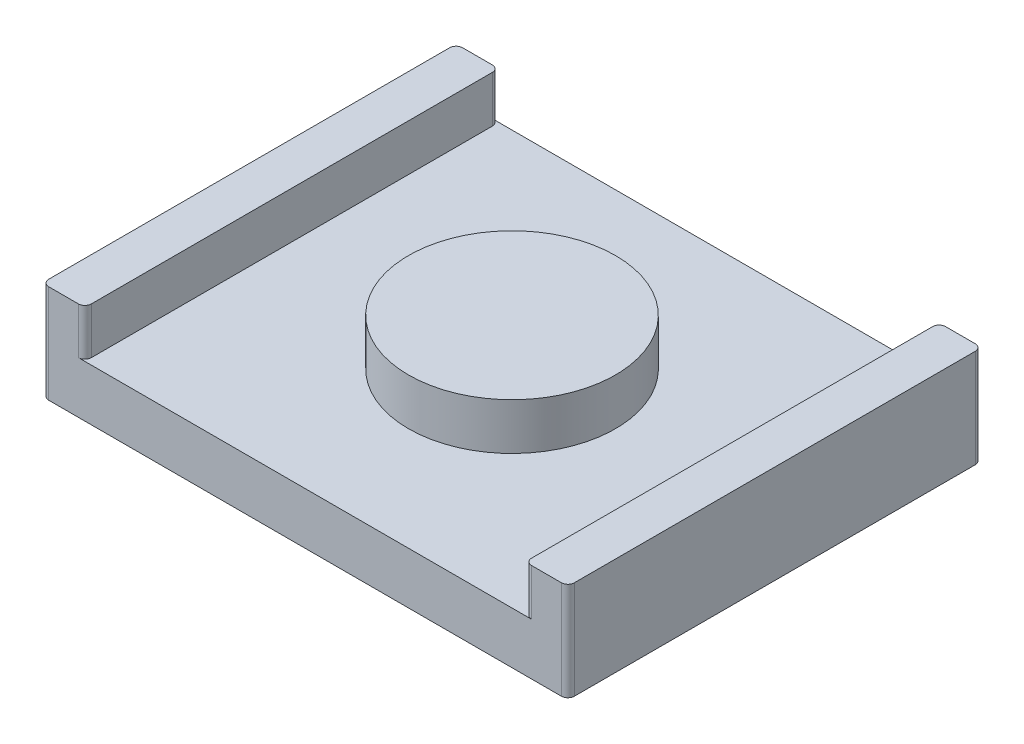
ISO-10303-21;
HEADER;
FILE_DESCRIPTION(('STEP AP214'),'2;1');
FILE_NAME('part.step','',(''),(''),'','','');
FILE_SCHEMA(('AUTOMOTIVE_DESIGN { 1 0 10303 214 1 1 1 1 }'));
ENDSEC;
DATA;
#1=APPLICATION_CONTEXT('core data for automotive mechanical design processes');
#2=APPLICATION_PROTOCOL_DEFINITION('international standard','automotive_design',2000,#1);
#3=PRODUCT_CONTEXT('',#1,'mechanical');
#4=PRODUCT('Part','Part','',(#3));
#5=PRODUCT_RELATED_PRODUCT_CATEGORY('part','',(#4));
#6=PRODUCT_DEFINITION_FORMATION('','',#4);
#7=PRODUCT_DEFINITION_CONTEXT('part definition',#1,'design');
#8=PRODUCT_DEFINITION('design','',#6,#7);
#9=PRODUCT_DEFINITION_SHAPE('','',#8);
#10=(LENGTH_UNIT() NAMED_UNIT(*) SI_UNIT(.MILLI.,.METRE.));
#11=(NAMED_UNIT(*) PLANE_ANGLE_UNIT() SI_UNIT($,.RADIAN.));
#12=(NAMED_UNIT(*) SI_UNIT($,.STERADIAN.) SOLID_ANGLE_UNIT());
#13=UNCERTAINTY_MEASURE_WITH_UNIT(LENGTH_MEASURE(1.E-05),#10,'distance_accuracy_value','');
#14=(GEOMETRIC_REPRESENTATION_CONTEXT(3) GLOBAL_UNCERTAINTY_ASSIGNED_CONTEXT((#13)) GLOBAL_UNIT_ASSIGNED_CONTEXT((#10,
#11,#12)) REPRESENTATION_CONTEXT('',''));
#15=CARTESIAN_POINT('',(0.,0.,0.));
#16=DIRECTION('',(0.,0.,1.));
#17=DIRECTION('',(1.,0.,0.));
#18=AXIS2_PLACEMENT_3D('',#15,#16,#17);
#19=CARTESIAN_POINT('',(0.,4.,0.));
#20=DIRECTION('',(0.,-1.,0.));
#21=DIRECTION('',(0.,0.,-1.));
#22=AXIS2_PLACEMENT_3D('',#19,#20,#21);
#23=PLANE('',#22);
#24=CARTESIAN_POINT('',(0.,4.,0.));
#25=DIRECTION('',(0.,1.,0.));
#26=DIRECTION('',(0.,0.,1.));
#27=AXIS2_PLACEMENT_3D('',#24,#25,#26);
#28=CIRCLE('',#27,8.);
#29=CARTESIAN_POINT('',(0.,4.,7.99999999999999));
#30=VERTEX_POINT('',#29);
#31=EDGE_CURVE('E180',#30,#30,#28,.T.);
#32=ORIENTED_EDGE('',*,*,#31,.F.);
#33=EDGE_LOOP('',(#32));
#34=FACE_BOUND('',#33,.T.);
#35=DIRECTION('',(1.,0.,0.));
#36=VECTOR('',#35,1.);
#37=CARTESIAN_POINT('',(-20.32,4.,16.));
#38=LINE('',#37,#36);
#39=CARTESIAN_POINT('',(-17.52,4.,16.));
#40=VERTEX_POINT('',#39);
#41=CARTESIAN_POINT('',(17.52,4.,16.));
#42=VERTEX_POINT('',#41);
#43=EDGE_CURVE('E191',#40,#42,#38,.T.);
#44=ORIENTED_EDGE('',*,*,#43,.T.);
#45=CARTESIAN_POINT('',(17.52,4.,15.5));
#46=DIRECTION('',(0.,-1.,0.));
#47=DIRECTION('',(0.,0.,-1.));
#48=AXIS2_PLACEMENT_3D('',#45,#46,#47);
#49=CIRCLE('',#48,0.5);
#50=CARTESIAN_POINT('',(17.02,4.,15.5));
#51=VERTEX_POINT('',#50);
#52=EDGE_CURVE('E276',#42,#51,#49,.T.);
#53=ORIENTED_EDGE('',*,*,#52,.T.);
#54=DIRECTION('',(0.,0.,-1.));
#55=VECTOR('',#54,1.);
#56=CARTESIAN_POINT('',(17.02,4.,-16.));
#57=LINE('',#56,#55);
#58=CARTESIAN_POINT('',(17.02,4.,-15.5));
#59=VERTEX_POINT('',#58);
#60=EDGE_CURVE('E400',#51,#59,#57,.T.);
#61=ORIENTED_EDGE('',*,*,#60,.T.);
#62=CARTESIAN_POINT('',(17.52,4.,-15.5));
#63=DIRECTION('',(0.,-1.,0.));
#64=DIRECTION('',(0.,0.,-1.));
#65=AXIS2_PLACEMENT_3D('',#62,#63,#64);
#66=CIRCLE('',#65,0.5);
#67=CARTESIAN_POINT('',(17.52,4.,-16.));
#68=VERTEX_POINT('',#67);
#69=EDGE_CURVE('E11',#59,#68,#66,.T.);
#70=ORIENTED_EDGE('',*,*,#69,.T.);
#71=DIRECTION('',(-1.,0.,0.));
#72=VECTOR('',#71,1.);
#73=CARTESIAN_POINT('',(-20.32,4.,-16.));
#74=LINE('',#73,#72);
#75=CARTESIAN_POINT('',(-17.52,4.,-16.));
#76=VERTEX_POINT('',#75);
#77=EDGE_CURVE('E184',#68,#76,#74,.T.);
#78=ORIENTED_EDGE('',*,*,#77,.T.);
#79=CARTESIAN_POINT('',(-17.52,4.,-15.5));
#80=DIRECTION('',(0.,-1.,0.));
#81=DIRECTION('',(0.,0.,-1.));
#82=AXIS2_PLACEMENT_3D('',#79,#80,#81);
#83=CIRCLE('',#82,0.5);
#84=CARTESIAN_POINT('',(-17.02,4.,-15.5));
#85=VERTEX_POINT('',#84);
#86=EDGE_CURVE('E52',#76,#85,#83,.T.);
#87=ORIENTED_EDGE('',*,*,#86,.T.);
#88=DIRECTION('',(0.,0.,-1.));
#89=VECTOR('',#88,1.);
#90=CARTESIAN_POINT('',(-17.02,4.,-16.));
#91=LINE('',#90,#89);
#92=CARTESIAN_POINT('',(-17.02,4.,15.5));
#93=VERTEX_POINT('',#92);
#94=EDGE_CURVE('E289',#93,#85,#91,.T.);
#95=ORIENTED_EDGE('',*,*,#94,.F.);
#96=CARTESIAN_POINT('',(-17.52,4.,15.5));
#97=DIRECTION('',(0.,-1.,0.));
#98=DIRECTION('',(0.,0.,-1.));
#99=AXIS2_PLACEMENT_3D('',#96,#97,#98);
#100=CIRCLE('',#99,0.5);
#101=EDGE_CURVE('E279',#93,#40,#100,.T.);
#102=ORIENTED_EDGE('',*,*,#101,.T.);
#103=EDGE_LOOP('',(#44,#53,#61,#70,#78,#87,#95,#102));
#104=FACE_BOUND('',#103,.T.);
#105=ADVANCED_FACE('F43',(#34,#104),#23,.F.);
#106=CARTESIAN_POINT('',(20.32,4.,16.));
#107=DIRECTION('',(-1.,0.,0.));
#108=DIRECTION('',(0.,0.,1.));
#109=AXIS2_PLACEMENT_3D('',#106,#107,#108);
#110=PLANE('',#109);
#111=DIRECTION('',(0.,0.,-1.));
#112=VECTOR('',#111,1.);
#113=CARTESIAN_POINT('',(20.32,0.,16.));
#114=LINE('',#113,#112);
#115=CARTESIAN_POINT('',(20.32,0.,15.5));
#116=VERTEX_POINT('',#115);
#117=CARTESIAN_POINT('',(20.32,0.,-15.5));
#118=VERTEX_POINT('',#117);
#119=EDGE_CURVE('E326',#116,#118,#114,.T.);
#120=ORIENTED_EDGE('',*,*,#119,.T.);
#121=DIRECTION('',(0.,-1.,0.));
#122=VECTOR('',#121,1.);
#123=CARTESIAN_POINT('',(20.32,4.,-15.5));
#124=LINE('',#123,#122);
#125=CARTESIAN_POINT('',(20.32,7.6,-15.5));
#126=VERTEX_POINT('',#125);
#127=EDGE_CURVE('E273',#118,#126,#124,.F.);
#128=ORIENTED_EDGE('',*,*,#127,.T.);
#129=DIRECTION('',(0.,0.,1.));
#130=VECTOR('',#129,1.);
#131=CARTESIAN_POINT('',(20.32,7.6,-16.));
#132=LINE('',#131,#130);
#133=CARTESIAN_POINT('',(20.32,7.6,15.5));
#134=VERTEX_POINT('',#133);
#135=EDGE_CURVE('E300',#126,#134,#132,.T.);
#136=ORIENTED_EDGE('',*,*,#135,.T.);
#137=DIRECTION('',(0.,-1.,0.));
#138=VECTOR('',#137,1.);
#139=CARTESIAN_POINT('',(20.32,4.,15.5));
#140=LINE('',#139,#138);
#141=EDGE_CURVE('E270',#134,#116,#140,.T.);
#142=ORIENTED_EDGE('',*,*,#141,.T.);
#143=EDGE_LOOP('',(#120,#128,#136,#142));
#144=FACE_BOUND('',#143,.T.);
#145=ADVANCED_FACE('F350',(#144),#110,.F.);
#146=CARTESIAN_POINT('',(-20.32,4.,-16.));
#147=DIRECTION('',(0.,0.,1.));
#148=DIRECTION('',(1.,0.,0.));
#149=AXIS2_PLACEMENT_3D('',#146,#147,#148);
#150=PLANE('',#149);
#151=DIRECTION('',(-1.,0.,0.));
#152=VECTOR('',#151,1.);
#153=CARTESIAN_POINT('',(-20.32,7.6,-16.));
#154=LINE('',#153,#152);
#155=CARTESIAN_POINT('',(-17.52,7.6,-16.));
#156=VERTEX_POINT('',#155);
#157=CARTESIAN_POINT('',(-19.82,7.6,-16.));
#158=VERTEX_POINT('',#157);
#159=EDGE_CURVE('E299',#156,#158,#154,.T.);
#160=ORIENTED_EDGE('',*,*,#159,.F.);
#161=DIRECTION('',(0.,-1.,0.));
#162=VECTOR('',#161,1.);
#163=CARTESIAN_POINT('',(-17.52,4.,-16.));
#164=LINE('',#163,#162);
#165=EDGE_CURVE('E254',#156,#76,#164,.T.);
#166=ORIENTED_EDGE('',*,*,#165,.T.);
#167=ORIENTED_EDGE('',*,*,#77,.F.);
#168=DIRECTION('',(0.,-1.,0.));
#169=VECTOR('',#168,1.);
#170=CARTESIAN_POINT('',(17.52,7.6,-16.));
#171=LINE('',#170,#169);
#172=CARTESIAN_POINT('',(17.52,7.6,-16.));
#173=VERTEX_POINT('',#172);
#174=EDGE_CURVE('E251',#68,#173,#171,.F.);
#175=ORIENTED_EDGE('',*,*,#174,.T.);
#176=DIRECTION('',(1.,0.,0.));
#177=VECTOR('',#176,1.);
#178=CARTESIAN_POINT('',(20.32,7.6,-16.));
#179=LINE('',#178,#177);
#180=CARTESIAN_POINT('',(19.82,7.6,-16.));
#181=VERTEX_POINT('',#180);
#182=EDGE_CURVE('E418',#173,#181,#179,.T.);
#183=ORIENTED_EDGE('',*,*,#182,.T.);
#184=DIRECTION('',(0.,-1.,0.));
#185=VECTOR('',#184,1.);
#186=CARTESIAN_POINT('',(19.82,4.,-16.));
#187=LINE('',#186,#185);
#188=CARTESIAN_POINT('',(19.82,0.,-16.));
#189=VERTEX_POINT('',#188);
#190=EDGE_CURVE('E244',#181,#189,#187,.T.);
#191=ORIENTED_EDGE('',*,*,#190,.T.);
#192=DIRECTION('',(-1.,0.,0.));
#193=VECTOR('',#192,1.);
#194=CARTESIAN_POINT('',(-20.32,0.,-16.));
#195=LINE('',#194,#193);
#196=CARTESIAN_POINT('',(-19.82,0.,-16.));
#197=VERTEX_POINT('',#196);
#198=EDGE_CURVE('E194',#189,#197,#195,.T.);
#199=ORIENTED_EDGE('',*,*,#198,.T.);
#200=DIRECTION('',(0.,-1.,0.));
#201=VECTOR('',#200,1.);
#202=CARTESIAN_POINT('',(-19.82,4.,-16.));
#203=LINE('',#202,#201);
#204=EDGE_CURVE('E248',#197,#158,#203,.F.);
#205=ORIENTED_EDGE('',*,*,#204,.T.);
#206=EDGE_LOOP('',(#160,#166,#167,#175,#183,#191,#199,#205));
#207=FACE_BOUND('',#206,.T.);
#208=ADVANCED_FACE('F311',(#207),#150,.F.);
#209=CARTESIAN_POINT('',(-20.32,4.,16.));
#210=DIRECTION('',(1.,0.,0.));
#211=DIRECTION('',(0.,0.,-1.));
#212=AXIS2_PLACEMENT_3D('',#209,#210,#211);
#213=PLANE('',#212);
#214=DIRECTION('',(0.,0.,1.));
#215=VECTOR('',#214,1.);
#216=CARTESIAN_POINT('',(-20.32,7.6,-16.));
#217=LINE('',#216,#215);
#218=CARTESIAN_POINT('',(-20.32,7.6,-15.5));
#219=VERTEX_POINT('',#218);
#220=CARTESIAN_POINT('',(-20.32,7.6,15.5));
#221=VERTEX_POINT('',#220);
#222=EDGE_CURVE('E314',#219,#221,#217,.T.);
#223=ORIENTED_EDGE('',*,*,#222,.F.);
#224=DIRECTION('',(0.,-1.,0.));
#225=VECTOR('',#224,1.);
#226=CARTESIAN_POINT('',(-20.32,4.,-15.5));
#227=LINE('',#226,#225);
#228=CARTESIAN_POINT('',(-20.32,0.,-15.5));
#229=VERTEX_POINT('',#228);
#230=EDGE_CURVE('E168',#219,#229,#227,.T.);
#231=ORIENTED_EDGE('',*,*,#230,.T.);
#232=DIRECTION('',(0.,0.,1.));
#233=VECTOR('',#232,1.);
#234=CARTESIAN_POINT('',(-20.32,0.,16.));
#235=LINE('',#234,#233);
#236=CARTESIAN_POINT('',(-20.32,0.,15.5));
#237=VERTEX_POINT('',#236);
#238=EDGE_CURVE('E185',#229,#237,#235,.T.);
#239=ORIENTED_EDGE('',*,*,#238,.T.);
#240=DIRECTION('',(0.,-1.,0.));
#241=VECTOR('',#240,1.);
#242=CARTESIAN_POINT('',(-20.32,4.,15.5));
#243=LINE('',#242,#241);
#244=EDGE_CURVE('E163',#237,#221,#243,.F.);
#245=ORIENTED_EDGE('',*,*,#244,.T.);
#246=EDGE_LOOP('',(#223,#231,#239,#245));
#247=FACE_BOUND('',#246,.T.);
#248=ADVANCED_FACE('F342',(#247),#213,.F.);
#249=CARTESIAN_POINT('',(-20.32,4.,16.));
#250=DIRECTION('',(0.,0.,-1.));
#251=DIRECTION('',(-1.,0.,0.));
#252=AXIS2_PLACEMENT_3D('',#249,#250,#251);
#253=PLANE('',#252);
#254=DIRECTION('',(-1.,0.,0.));
#255=VECTOR('',#254,1.);
#256=CARTESIAN_POINT('',(20.32,7.6,16.));
#257=LINE('',#256,#255);
#258=CARTESIAN_POINT('',(19.82,7.6,16.));
#259=VERTEX_POINT('',#258);
#260=CARTESIAN_POINT('',(17.52,7.6,16.));
#261=VERTEX_POINT('',#260);
#262=EDGE_CURVE('E406',#259,#261,#257,.T.);
#263=ORIENTED_EDGE('',*,*,#262,.T.);
#264=DIRECTION('',(0.,-1.,0.));
#265=VECTOR('',#264,1.);
#266=CARTESIAN_POINT('',(17.52,4.,16.));
#267=LINE('',#266,#265);
#268=EDGE_CURVE('E203',#261,#42,#267,.T.);
#269=ORIENTED_EDGE('',*,*,#268,.T.);
#270=ORIENTED_EDGE('',*,*,#43,.F.);
#271=DIRECTION('',(0.,-1.,0.));
#272=VECTOR('',#271,1.);
#273=CARTESIAN_POINT('',(-17.52,4.,16.));
#274=LINE('',#273,#272);
#275=CARTESIAN_POINT('',(-17.52,7.6,16.));
#276=VERTEX_POINT('',#275);
#277=EDGE_CURVE('E200',#40,#276,#274,.F.);
#278=ORIENTED_EDGE('',*,*,#277,.T.);
#279=DIRECTION('',(1.,0.,0.));
#280=VECTOR('',#279,1.);
#281=CARTESIAN_POINT('',(-20.32,7.6,16.));
#282=LINE('',#281,#280);
#283=CARTESIAN_POINT('',(-19.82,7.6,16.));
#284=VERTEX_POINT('',#283);
#285=EDGE_CURVE('E177',#284,#276,#282,.T.);
#286=ORIENTED_EDGE('',*,*,#285,.F.);
#287=DIRECTION('',(0.,-1.,0.));
#288=VECTOR('',#287,1.);
#289=CARTESIAN_POINT('',(-19.82,4.,16.));
#290=LINE('',#289,#288);
#291=CARTESIAN_POINT('',(-19.82,0.,16.));
#292=VERTEX_POINT('',#291);
#293=EDGE_CURVE('E162',#284,#292,#290,.T.);
#294=ORIENTED_EDGE('',*,*,#293,.T.);
#295=DIRECTION('',(1.,0.,0.));
#296=VECTOR('',#295,1.);
#297=CARTESIAN_POINT('',(-20.32,0.,16.));
#298=LINE('',#297,#296);
#299=CARTESIAN_POINT('',(19.82,0.,16.));
#300=VERTEX_POINT('',#299);
#301=EDGE_CURVE('E175',#292,#300,#298,.T.);
#302=ORIENTED_EDGE('',*,*,#301,.T.);
#303=DIRECTION('',(0.,-1.,0.));
#304=VECTOR('',#303,1.);
#305=CARTESIAN_POINT('',(19.82,4.,16.));
#306=LINE('',#305,#304);
#307=EDGE_CURVE('E179',#300,#259,#306,.F.);
#308=ORIENTED_EDGE('',*,*,#307,.T.);
#309=EDGE_LOOP('',(#263,#269,#270,#278,#286,#294,#302,#308));
#310=FACE_BOUND('',#309,.T.);
#311=ADVANCED_FACE('F174',(#310),#253,.F.);
#312=CARTESIAN_POINT('',(0.,0.,0.));
#313=DIRECTION('',(0.,-1.,0.));
#314=DIRECTION('',(0.,0.,-1.));
#315=AXIS2_PLACEMENT_3D('',#312,#313,#314);
#316=PLANE('',#315);
#317=ORIENTED_EDGE('',*,*,#238,.F.);
#318=CARTESIAN_POINT('',(-19.82,0.,-15.5));
#319=DIRECTION('',(0.,-1.,0.));
#320=DIRECTION('',(0.,0.,-1.));
#321=AXIS2_PLACEMENT_3D('',#318,#319,#320);
#322=CIRCLE('',#321,0.5);
#323=EDGE_CURVE('E267',#229,#197,#322,.T.);
#324=ORIENTED_EDGE('',*,*,#323,.T.);
#325=ORIENTED_EDGE('',*,*,#198,.F.);
#326=CARTESIAN_POINT('',(19.82,0.,-15.5));
#327=DIRECTION('',(0.,-1.,0.));
#328=DIRECTION('',(0.,0.,-1.));
#329=AXIS2_PLACEMENT_3D('',#326,#327,#328);
#330=CIRCLE('',#329,0.5);
#331=EDGE_CURVE('E59',#189,#118,#330,.T.);
#332=ORIENTED_EDGE('',*,*,#331,.T.);
#333=ORIENTED_EDGE('',*,*,#119,.F.);
#334=CARTESIAN_POINT('',(19.82,0.,15.5));
#335=DIRECTION('',(0.,-1.,0.));
#336=DIRECTION('',(0.,0.,-1.));
#337=AXIS2_PLACEMENT_3D('',#334,#335,#336);
#338=CIRCLE('',#337,0.5);
#339=EDGE_CURVE('E67',#116,#300,#338,.T.);
#340=ORIENTED_EDGE('',*,*,#339,.T.);
#341=ORIENTED_EDGE('',*,*,#301,.F.);
#342=CARTESIAN_POINT('',(-19.82,0.,15.5));
#343=DIRECTION('',(0.,-1.,0.));
#344=DIRECTION('',(0.,0.,-1.));
#345=AXIS2_PLACEMENT_3D('',#342,#343,#344);
#346=CIRCLE('',#345,0.5);
#347=EDGE_CURVE('E159',#292,#237,#346,.T.);
#348=ORIENTED_EDGE('',*,*,#347,.T.);
#349=EDGE_LOOP('',(#317,#324,#325,#332,#333,#340,#341,#348));
#350=FACE_BOUND('',#349,.T.);
#351=ADVANCED_FACE('F182',(#350),#316,.T.);
#352=CARTESIAN_POINT('',(0.,7.6,0.));
#353=DIRECTION('',(0.,-1.,0.));
#354=DIRECTION('',(0.,0.,-1.));
#355=AXIS2_PLACEMENT_3D('',#352,#353,#354);
#356=CYLINDRICAL_SURFACE('',#355,8.);
#357=CARTESIAN_POINT('',(0.,7.6,0.));
#358=DIRECTION('',(0.,1.,0.));
#359=DIRECTION('',(0.,0.,1.));
#360=AXIS2_PLACEMENT_3D('',#357,#358,#359);
#361=CIRCLE('',#360,8.);
#362=CARTESIAN_POINT('',(0.,7.6,7.99999999999999));
#363=VERTEX_POINT('',#362);
#364=EDGE_CURVE('E322',#363,#363,#361,.T.);
#365=ORIENTED_EDGE('',*,*,#364,.F.);
#366=EDGE_LOOP('',(#365));
#367=FACE_BOUND('',#366,.T.);
#368=ORIENTED_EDGE('',*,*,#31,.T.);
#369=EDGE_LOOP('',(#368));
#370=FACE_BOUND('',#369,.T.);
#371=ADVANCED_FACE('F363',(#367,#370),#356,.T.);
#372=CARTESIAN_POINT('',(0.,7.6,0.));
#373=DIRECTION('',(0.,1.,0.));
#374=DIRECTION('',(0.,0.,1.));
#375=AXIS2_PLACEMENT_3D('',#372,#373,#374);
#376=PLANE('',#375);
#377=ORIENTED_EDGE('',*,*,#364,.T.);
#378=EDGE_LOOP('',(#377));
#379=FACE_BOUND('',#378,.T.);
#380=ADVANCED_FACE('F369',(#379),#376,.T.);
#381=CARTESIAN_POINT('',(-17.02,39.769706246716,-16.));
#382=DIRECTION('',(-1.,0.,0.));
#383=DIRECTION('',(0.,0.,1.));
#384=AXIS2_PLACEMENT_3D('',#381,#382,#383);
#385=PLANE('',#384);
#386=DIRECTION('',(0.,0.,-1.));
#387=VECTOR('',#386,1.);
#388=CARTESIAN_POINT('',(-17.02,7.6,-16.));
#389=LINE('',#388,#387);
#390=CARTESIAN_POINT('',(-17.02,7.6,15.5));
#391=VERTEX_POINT('',#390);
#392=CARTESIAN_POINT('',(-17.02,7.6,-15.5));
#393=VERTEX_POINT('',#392);
#394=EDGE_CURVE('E309',#391,#393,#389,.T.);
#395=ORIENTED_EDGE('',*,*,#394,.F.);
#396=DIRECTION('',(0.,-1.,0.));
#397=VECTOR('',#396,1.);
#398=CARTESIAN_POINT('',(-17.02,39.769706246716,15.5));
#399=LINE('',#398,#397);
#400=EDGE_CURVE('E228',#391,#93,#399,.T.);
#401=ORIENTED_EDGE('',*,*,#400,.T.);
#402=ORIENTED_EDGE('',*,*,#94,.T.);
#403=DIRECTION('',(0.,-1.,0.));
#404=VECTOR('',#403,1.);
#405=CARTESIAN_POINT('',(-17.02,39.769706246716,-15.5));
#406=LINE('',#405,#404);
#407=EDGE_CURVE('E225',#85,#393,#406,.F.);
#408=ORIENTED_EDGE('',*,*,#407,.T.);
#409=EDGE_LOOP('',(#395,#401,#402,#408));
#410=FACE_BOUND('',#409,.T.);
#411=ADVANCED_FACE('F295',(#410),#385,.F.);
#412=CARTESIAN_POINT('',(0.,7.6,0.));
#413=DIRECTION('',(0.,1.,0.));
#414=DIRECTION('',(0.,0.,1.));
#415=AXIS2_PLACEMENT_3D('',#412,#413,#414);
#416=PLANE('',#415);
#417=ORIENTED_EDGE('',*,*,#285,.T.);
#418=CARTESIAN_POINT('',(-17.52,7.6,15.5));
#419=DIRECTION('',(0.,1.,0.));
#420=DIRECTION('',(0.,0.,1.));
#421=AXIS2_PLACEMENT_3D('',#418,#419,#420);
#422=CIRCLE('',#421,0.5);
#423=EDGE_CURVE('E241',#276,#391,#422,.T.);
#424=ORIENTED_EDGE('',*,*,#423,.T.);
#425=ORIENTED_EDGE('',*,*,#394,.T.);
#426=CARTESIAN_POINT('',(-17.52,7.6,-15.5));
#427=DIRECTION('',(0.,1.,0.));
#428=DIRECTION('',(0.,0.,1.));
#429=AXIS2_PLACEMENT_3D('',#426,#427,#428);
#430=CIRCLE('',#429,0.5);
#431=EDGE_CURVE('E238',#393,#156,#430,.T.);
#432=ORIENTED_EDGE('',*,*,#431,.T.);
#433=ORIENTED_EDGE('',*,*,#159,.T.);
#434=CARTESIAN_POINT('',(-19.82,7.6,-15.5));
#435=DIRECTION('',(0.,1.,0.));
#436=DIRECTION('',(0.,0.,1.));
#437=AXIS2_PLACEMENT_3D('',#434,#435,#436);
#438=CIRCLE('',#437,0.5);
#439=EDGE_CURVE('E235',#158,#219,#438,.T.);
#440=ORIENTED_EDGE('',*,*,#439,.T.);
#441=ORIENTED_EDGE('',*,*,#222,.T.);
#442=CARTESIAN_POINT('',(-19.82,7.6,15.5));
#443=DIRECTION('',(0.,1.,0.));
#444=DIRECTION('',(0.,0.,1.));
#445=AXIS2_PLACEMENT_3D('',#442,#443,#444);
#446=CIRCLE('',#445,0.5);
#447=EDGE_CURVE('E232',#221,#284,#446,.T.);
#448=ORIENTED_EDGE('',*,*,#447,.T.);
#449=EDGE_LOOP('',(#417,#424,#425,#432,#433,#440,#441,#448));
#450=FACE_BOUND('',#449,.T.);
#451=ADVANCED_FACE('F307',(#450),#416,.T.);
#452=CARTESIAN_POINT('',(0.,7.6,0.));
#453=DIRECTION('',(0.,1.,0.));
#454=DIRECTION('',(0.,0.,1.));
#455=AXIS2_PLACEMENT_3D('',#452,#453,#454);
#456=PLANE('',#455);
#457=DIRECTION('',(0.,0.,-1.));
#458=VECTOR('',#457,1.);
#459=CARTESIAN_POINT('',(17.02,7.6,-16.));
#460=LINE('',#459,#458);
#461=CARTESIAN_POINT('',(17.02,7.6,15.5));
#462=VERTEX_POINT('',#461);
#463=CARTESIAN_POINT('',(17.02,7.6,-15.5));
#464=VERTEX_POINT('',#463);
#465=EDGE_CURVE('E413',#462,#464,#460,.T.);
#466=ORIENTED_EDGE('',*,*,#465,.F.);
#467=CARTESIAN_POINT('',(17.52,7.6,15.5));
#468=DIRECTION('',(0.,1.,0.));
#469=DIRECTION('',(0.,0.,1.));
#470=AXIS2_PLACEMENT_3D('',#467,#468,#469);
#471=CIRCLE('',#470,0.5);
#472=EDGE_CURVE('E222',#462,#261,#471,.T.);
#473=ORIENTED_EDGE('',*,*,#472,.T.);
#474=ORIENTED_EDGE('',*,*,#262,.F.);
#475=CARTESIAN_POINT('',(19.82,7.6,15.5));
#476=DIRECTION('',(0.,1.,0.));
#477=DIRECTION('',(0.,0.,1.));
#478=AXIS2_PLACEMENT_3D('',#475,#476,#477);
#479=CIRCLE('',#478,0.5);
#480=EDGE_CURVE('E214',#259,#134,#479,.T.);
#481=ORIENTED_EDGE('',*,*,#480,.T.);
#482=ORIENTED_EDGE('',*,*,#135,.F.);
#483=CARTESIAN_POINT('',(19.82,7.6,-15.5));
#484=DIRECTION('',(0.,1.,0.));
#485=DIRECTION('',(0.,0.,1.));
#486=AXIS2_PLACEMENT_3D('',#483,#484,#485);
#487=CIRCLE('',#486,0.5);
#488=EDGE_CURVE('E217',#126,#181,#487,.T.);
#489=ORIENTED_EDGE('',*,*,#488,.T.);
#490=ORIENTED_EDGE('',*,*,#182,.F.);
#491=CARTESIAN_POINT('',(17.52,7.6,-15.5));
#492=DIRECTION('',(0.,1.,0.));
#493=DIRECTION('',(0.,0.,1.));
#494=AXIS2_PLACEMENT_3D('',#491,#492,#493);
#495=CIRCLE('',#494,0.5);
#496=EDGE_CURVE('E220',#173,#464,#495,.T.);
#497=ORIENTED_EDGE('',*,*,#496,.T.);
#498=EDGE_LOOP('',(#466,#473,#474,#481,#482,#489,#490,#497));
#499=FACE_BOUND('',#498,.T.);
#500=ADVANCED_FACE('F383',(#499),#456,.T.);
#501=CARTESIAN_POINT('',(17.02,39.769706246716,-16.));
#502=DIRECTION('',(-1.,0.,0.));
#503=DIRECTION('',(0.,0.,1.));
#504=AXIS2_PLACEMENT_3D('',#501,#502,#503);
#505=PLANE('',#504);
#506=ORIENTED_EDGE('',*,*,#60,.F.);
#507=DIRECTION('',(0.,-1.,0.));
#508=VECTOR('',#507,1.);
#509=CARTESIAN_POINT('',(17.02,7.6,15.5));
#510=LINE('',#509,#508);
#511=EDGE_CURVE('E211',#51,#462,#510,.F.);
#512=ORIENTED_EDGE('',*,*,#511,.T.);
#513=ORIENTED_EDGE('',*,*,#465,.T.);
#514=DIRECTION('',(0.,-1.,0.));
#515=VECTOR('',#514,1.);
#516=CARTESIAN_POINT('',(17.02,4.,-15.5));
#517=LINE('',#516,#515);
#518=EDGE_CURVE('E207',#464,#59,#517,.T.);
#519=ORIENTED_EDGE('',*,*,#518,.T.);
#520=EDGE_LOOP('',(#506,#512,#513,#519));
#521=FACE_BOUND('',#520,.T.);
#522=ADVANCED_FACE('F387',(#521),#505,.T.);
#523=CARTESIAN_POINT('',(17.52,4.,15.5));
#524=DIRECTION('',(0.,1.,0.));
#525=DIRECTION('',(0.,0.,1.));
#526=AXIS2_PLACEMENT_3D('',#523,#524,#525);
#527=CYLINDRICAL_SURFACE('',#526,0.5);
#528=ORIENTED_EDGE('',*,*,#472,.F.);
#529=ORIENTED_EDGE('',*,*,#511,.F.);
#530=ORIENTED_EDGE('',*,*,#52,.F.);
#531=ORIENTED_EDGE('',*,*,#268,.F.);
#532=EDGE_LOOP('',(#528,#529,#530,#531));
#533=FACE_BOUND('',#532,.T.);
#534=ADVANCED_FACE('F390',(#533),#527,.T.);
#535=CARTESIAN_POINT('',(-17.52,39.769706246716,15.5));
#536=DIRECTION('',(0.,-1.,0.));
#537=DIRECTION('',(0.,0.,-1.));
#538=AXIS2_PLACEMENT_3D('',#535,#536,#537);
#539=CYLINDRICAL_SURFACE('',#538,0.5);
#540=ORIENTED_EDGE('',*,*,#423,.F.);
#541=ORIENTED_EDGE('',*,*,#277,.F.);
#542=ORIENTED_EDGE('',*,*,#101,.F.);
#543=ORIENTED_EDGE('',*,*,#400,.F.);
#544=EDGE_LOOP('',(#540,#541,#542,#543));
#545=FACE_BOUND('',#544,.T.);
#546=ADVANCED_FACE('F395',(#545),#539,.T.);
#547=CARTESIAN_POINT('',(-17.52,4.,-15.5));
#548=DIRECTION('',(0.,-1.,0.));
#549=DIRECTION('',(0.,0.,-1.));
#550=AXIS2_PLACEMENT_3D('',#547,#548,#549);
#551=CYLINDRICAL_SURFACE('',#550,0.5);
#552=ORIENTED_EDGE('',*,*,#431,.F.);
#553=ORIENTED_EDGE('',*,*,#407,.F.);
#554=ORIENTED_EDGE('',*,*,#86,.F.);
#555=ORIENTED_EDGE('',*,*,#165,.F.);
#556=EDGE_LOOP('',(#552,#553,#554,#555));
#557=FACE_BOUND('',#556,.T.);
#558=ADVANCED_FACE('F303',(#557),#551,.T.);
#559=CARTESIAN_POINT('',(17.52,39.769706246716,-15.5));
#560=DIRECTION('',(0.,1.,0.));
#561=DIRECTION('',(0.,0.,1.));
#562=AXIS2_PLACEMENT_3D('',#559,#560,#561);
#563=CYLINDRICAL_SURFACE('',#562,0.5);
#564=ORIENTED_EDGE('',*,*,#496,.F.);
#565=ORIENTED_EDGE('',*,*,#174,.F.);
#566=ORIENTED_EDGE('',*,*,#69,.F.);
#567=ORIENTED_EDGE('',*,*,#518,.F.);
#568=EDGE_LOOP('',(#564,#565,#566,#567));
#569=FACE_BOUND('',#568,.T.);
#570=ADVANCED_FACE('F436',(#569),#563,.T.);
#571=CARTESIAN_POINT('',(-19.82,4.,-15.5));
#572=DIRECTION('',(0.,-1.,0.));
#573=DIRECTION('',(0.,0.,-1.));
#574=AXIS2_PLACEMENT_3D('',#571,#572,#573);
#575=CYLINDRICAL_SURFACE('',#574,0.5);
#576=ORIENTED_EDGE('',*,*,#439,.F.);
#577=ORIENTED_EDGE('',*,*,#204,.F.);
#578=ORIENTED_EDGE('',*,*,#323,.F.);
#579=ORIENTED_EDGE('',*,*,#230,.F.);
#580=EDGE_LOOP('',(#576,#577,#578,#579));
#581=FACE_BOUND('',#580,.T.);
#582=ADVANCED_FACE('F338',(#581),#575,.T.);
#583=CARTESIAN_POINT('',(19.82,4.,-15.5));
#584=DIRECTION('',(0.,-1.,0.));
#585=DIRECTION('',(0.,0.,-1.));
#586=AXIS2_PLACEMENT_3D('',#583,#584,#585);
#587=CYLINDRICAL_SURFACE('',#586,0.5);
#588=ORIENTED_EDGE('',*,*,#488,.F.);
#589=ORIENTED_EDGE('',*,*,#127,.F.);
#590=ORIENTED_EDGE('',*,*,#331,.F.);
#591=ORIENTED_EDGE('',*,*,#190,.F.);
#592=EDGE_LOOP('',(#588,#589,#590,#591));
#593=FACE_BOUND('',#592,.T.);
#594=ADVANCED_FACE('F444',(#593),#587,.T.);
#595=CARTESIAN_POINT('',(19.82,4.,15.5));
#596=DIRECTION('',(0.,-1.,0.));
#597=DIRECTION('',(0.,0.,-1.));
#598=AXIS2_PLACEMENT_3D('',#595,#596,#597);
#599=CYLINDRICAL_SURFACE('',#598,0.5);
#600=ORIENTED_EDGE('',*,*,#480,.F.);
#601=ORIENTED_EDGE('',*,*,#307,.F.);
#602=ORIENTED_EDGE('',*,*,#339,.F.);
#603=ORIENTED_EDGE('',*,*,#141,.F.);
#604=EDGE_LOOP('',(#600,#601,#602,#603));
#605=FACE_BOUND('',#604,.T.);
#606=ADVANCED_FACE('F446',(#605),#599,.T.);
#607=CARTESIAN_POINT('',(-19.82,4.,15.5));
#608=DIRECTION('',(0.,-1.,0.));
#609=DIRECTION('',(0.,0.,-1.));
#610=AXIS2_PLACEMENT_3D('',#607,#608,#609);
#611=CYLINDRICAL_SURFACE('',#610,0.5);
#612=ORIENTED_EDGE('',*,*,#447,.F.);
#613=ORIENTED_EDGE('',*,*,#244,.F.);
#614=ORIENTED_EDGE('',*,*,#347,.F.);
#615=ORIENTED_EDGE('',*,*,#293,.F.);
#616=EDGE_LOOP('',(#612,#613,#614,#615));
#617=FACE_BOUND('',#616,.T.);
#618=ADVANCED_FACE('F45',(#617),#611,.T.);
#619=CLOSED_SHELL('',(#105,#145,#208,#248,#311,#351,#371,#380,#411,#451,#500,#522,#534,#546,
#558,#570,#582,#594,#606,#618));
#620=MANIFOLD_SOLID_BREP('B2',#619);
#621=ADVANCED_BREP_SHAPE_REPRESENTATION('',(#18,#620),#14);
#622=SHAPE_DEFINITION_REPRESENTATION(#9,#621);
ENDSEC;
END-ISO-10303-21;
